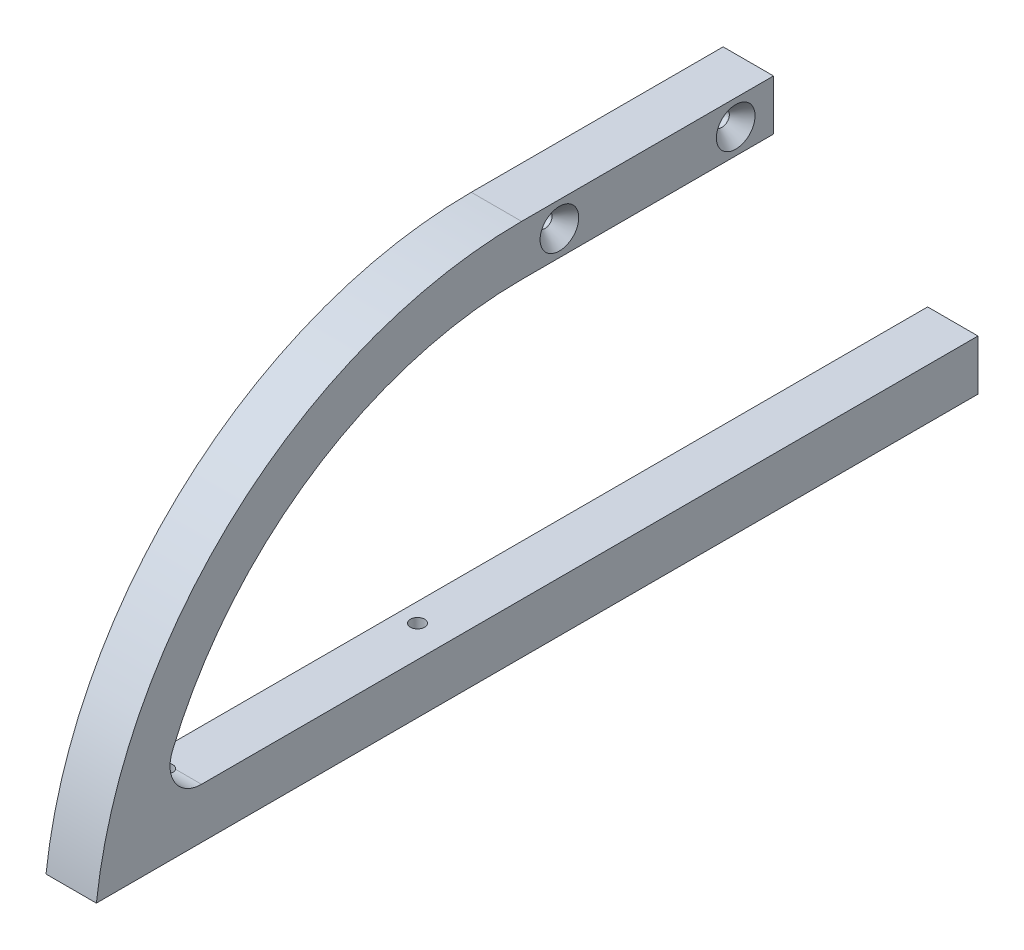
ISO-10303-21;
HEADER;
FILE_DESCRIPTION(('STEP AP214'),'2;1');
FILE_NAME('part.step','',(''),(''),'','','');
FILE_SCHEMA(('AUTOMOTIVE_DESIGN { 1 0 10303 214 1 1 1 1 }'));
ENDSEC;
DATA;
#1=APPLICATION_CONTEXT('core data for automotive mechanical design processes');
#2=APPLICATION_PROTOCOL_DEFINITION('international standard','automotive_design',2000,#1);
#3=PRODUCT_CONTEXT('',#1,'mechanical');
#4=PRODUCT('Part','Part','',(#3));
#5=PRODUCT_RELATED_PRODUCT_CATEGORY('part','',(#4));
#6=PRODUCT_DEFINITION_FORMATION('','',#4);
#7=PRODUCT_DEFINITION_CONTEXT('part definition',#1,'design');
#8=PRODUCT_DEFINITION('design','',#6,#7);
#9=PRODUCT_DEFINITION_SHAPE('','',#8);
#10=(LENGTH_UNIT() NAMED_UNIT(*) SI_UNIT(.MILLI.,.METRE.));
#11=(NAMED_UNIT(*) PLANE_ANGLE_UNIT() SI_UNIT($,.RADIAN.));
#12=(NAMED_UNIT(*) SI_UNIT($,.STERADIAN.) SOLID_ANGLE_UNIT());
#13=UNCERTAINTY_MEASURE_WITH_UNIT(LENGTH_MEASURE(1.E-05),#10,'distance_accuracy_value','');
#14=(GEOMETRIC_REPRESENTATION_CONTEXT(3) GLOBAL_UNCERTAINTY_ASSIGNED_CONTEXT((#13)) GLOBAL_UNIT_ASSIGNED_CONTEXT((#10,
#11,#12)) REPRESENTATION_CONTEXT('',''));
#15=CARTESIAN_POINT('',(0.,0.,0.));
#16=DIRECTION('',(0.,0.,1.));
#17=DIRECTION('',(1.,0.,0.));
#18=AXIS2_PLACEMENT_3D('',#15,#16,#17);
#19=CARTESIAN_POINT('',(10.16,0.,0.));
#20=DIRECTION('',(0.,0.,1.));
#21=DIRECTION('',(0.,-1.,0.));
#22=AXIS2_PLACEMENT_3D('',#19,#20,#21);
#23=PLANE('',#22);
#24=DIRECTION('',(0.,1.,0.));
#25=VECTOR('',#24,1.);
#26=CARTESIAN_POINT('',(0.,0.,0.));
#27=LINE('',#26,#25);
#28=CARTESIAN_POINT('',(0.,-10.16,0.));
#29=VERTEX_POINT('',#28);
#30=CARTESIAN_POINT('',(0.,0.,0.));
#31=VERTEX_POINT('',#30);
#32=EDGE_CURVE('E147',#29,#31,#27,.T.);
#33=ORIENTED_EDGE('',*,*,#32,.T.);
#34=DIRECTION('',(-1.,0.,0.));
#35=VECTOR('',#34,1.);
#36=CARTESIAN_POINT('',(10.16,0.,0.));
#37=LINE('',#36,#35);
#38=CARTESIAN_POINT('',(10.16,0.,0.));
#39=VERTEX_POINT('',#38);
#40=EDGE_CURVE('E11',#39,#31,#37,.T.);
#41=ORIENTED_EDGE('',*,*,#40,.F.);
#42=DIRECTION('',(0.,1.,0.));
#43=VECTOR('',#42,1.);
#44=CARTESIAN_POINT('',(10.16,0.,0.));
#45=LINE('',#44,#43);
#46=CARTESIAN_POINT('',(10.16,-10.16,0.));
#47=VERTEX_POINT('',#46);
#48=EDGE_CURVE('E166',#47,#39,#45,.T.);
#49=ORIENTED_EDGE('',*,*,#48,.F.);
#50=DIRECTION('',(-1.,0.,0.));
#51=VECTOR('',#50,1.);
#52=CARTESIAN_POINT('',(10.16,-10.16,0.));
#53=LINE('',#52,#51);
#54=EDGE_CURVE('E143',#47,#29,#53,.T.);
#55=ORIENTED_EDGE('',*,*,#54,.T.);
#56=EDGE_LOOP('',(#33,#41,#49,#55));
#57=FACE_BOUND('',#56,.T.);
#58=ADVANCED_FACE('F35',(#57),#23,.F.);
#59=CARTESIAN_POINT('',(10.16,0.,0.));
#60=DIRECTION('',(0.,-1.,0.));
#61=DIRECTION('',(0.,0.,-1.));
#62=AXIS2_PLACEMENT_3D('',#59,#60,#61);
#63=PLANE('',#62);
#64=DIRECTION('',(0.,0.,1.));
#65=VECTOR('',#64,1.);
#66=CARTESIAN_POINT('',(0.,0.,0.));
#67=LINE('',#66,#65);
#68=CARTESIAN_POINT('',(0.,0.,50.8));
#69=VERTEX_POINT('',#68);
#70=EDGE_CURVE('E150',#31,#69,#67,.T.);
#71=ORIENTED_EDGE('',*,*,#70,.T.);
#72=DIRECTION('',(-1.,0.,0.));
#73=VECTOR('',#72,1.);
#74=CARTESIAN_POINT('',(10.16,0.,50.8));
#75=LINE('',#74,#73);
#76=CARTESIAN_POINT('',(10.16,0.,50.8));
#77=VERTEX_POINT('',#76);
#78=EDGE_CURVE('E43',#77,#69,#75,.T.);
#79=ORIENTED_EDGE('',*,*,#78,.F.);
#80=DIRECTION('',(0.,0.,1.));
#81=VECTOR('',#80,1.);
#82=CARTESIAN_POINT('',(10.16,0.,0.));
#83=LINE('',#82,#81);
#84=EDGE_CURVE('E102',#39,#77,#83,.T.);
#85=ORIENTED_EDGE('',*,*,#84,.F.);
#86=ORIENTED_EDGE('',*,*,#40,.T.);
#87=EDGE_LOOP('',(#71,#79,#85,#86));
#88=FACE_BOUND('',#87,.T.);
#89=ADVANCED_FACE('F249',(#88),#63,.F.);
#90=CARTESIAN_POINT('',(10.16,-86.36,50.8));
#91=DIRECTION('',(-1.,0.,0.));
#92=DIRECTION('',(0.,0.,1.));
#93=AXIS2_PLACEMENT_3D('',#90,#91,#92);
#94=CYLINDRICAL_SURFACE('',#93,86.36);
#95=CARTESIAN_POINT('',(0.,-86.36,50.8));
#96=DIRECTION('',(1.,0.,0.));
#97=DIRECTION('',(0.,0.,-1.));
#98=AXIS2_PLACEMENT_3D('',#95,#96,#97);
#99=CIRCLE('',#98,86.36);
#100=CARTESIAN_POINT('',(0.,-76.2,136.560270521961));
#101=VERTEX_POINT('',#100);
#102=EDGE_CURVE('E153',#69,#101,#99,.T.);
#103=ORIENTED_EDGE('',*,*,#102,.T.);
#104=DIRECTION('',(-1.,0.,0.));
#105=VECTOR('',#104,1.);
#106=CARTESIAN_POINT('',(10.16,-76.2,136.560270521961));
#107=LINE('',#106,#105);
#108=CARTESIAN_POINT('',(10.16,-76.2,136.560270521961));
#109=VERTEX_POINT('',#108);
#110=EDGE_CURVE('E177',#109,#101,#107,.T.);
#111=ORIENTED_EDGE('',*,*,#110,.F.);
#112=CARTESIAN_POINT('',(10.16,-86.36,50.8));
#113=DIRECTION('',(1.,0.,0.));
#114=DIRECTION('',(0.,0.,-1.));
#115=AXIS2_PLACEMENT_3D('',#112,#113,#114);
#116=CIRCLE('',#115,86.36);
#117=EDGE_CURVE('E186',#77,#109,#116,.T.);
#118=ORIENTED_EDGE('',*,*,#117,.F.);
#119=ORIENTED_EDGE('',*,*,#78,.T.);
#120=EDGE_LOOP('',(#103,#111,#118,#119));
#121=FACE_BOUND('',#120,.T.);
#122=ADVANCED_FACE('F184',(#121),#94,.T.);
#123=CARTESIAN_POINT('',(10.16,-76.2,136.560270521961));
#124=DIRECTION('',(0.,1.,0.));
#125=DIRECTION('',(0.,0.,1.));
#126=AXIS2_PLACEMENT_3D('',#123,#124,#125);
#127=PLANE('',#126);
#128=CARTESIAN_POINT('',(3.81,-76.2,116.240270521961));
#129=DIRECTION('',(0.,-1.,0.));
#130=DIRECTION('',(0.,0.,-1.));
#131=AXIS2_PLACEMENT_3D('',#128,#129,#130);
#132=CIRCLE('',#131,1.4224);
#133=CARTESIAN_POINT('',(3.81,-76.2,114.817870521961));
#134=VERTEX_POINT('',#133);
#135=EDGE_CURVE('E214',#134,#134,#132,.T.);
#136=ORIENTED_EDGE('',*,*,#135,.F.);
#137=EDGE_LOOP('',(#136));
#138=FACE_BOUND('',#137,.T.);
#139=CARTESIAN_POINT('',(3.81,-76.2,65.4402705219614));
#140=DIRECTION('',(0.,-1.,0.));
#141=DIRECTION('',(0.,0.,-1.));
#142=AXIS2_PLACEMENT_3D('',#139,#140,#141);
#143=CIRCLE('',#142,1.4224);
#144=CARTESIAN_POINT('',(3.81,-76.2,64.0178705219614));
#145=VERTEX_POINT('',#144);
#146=EDGE_CURVE('E215',#145,#145,#143,.T.);
#147=ORIENTED_EDGE('',*,*,#146,.F.);
#148=EDGE_LOOP('',(#147));
#149=FACE_BOUND('',#148,.T.);
#150=DIRECTION('',(0.,0.,-1.));
#151=VECTOR('',#150,1.);
#152=CARTESIAN_POINT('',(0.,-76.2,136.560270521961));
#153=LINE('',#152,#151);
#154=CARTESIAN_POINT('',(0.,-76.2,-41.2397294780386));
#155=VERTEX_POINT('',#154);
#156=EDGE_CURVE('E155',#101,#155,#153,.T.);
#157=ORIENTED_EDGE('',*,*,#156,.T.);
#158=DIRECTION('',(-1.,0.,0.));
#159=VECTOR('',#158,1.);
#160=CARTESIAN_POINT('',(10.16,-76.2,-41.2397294780386));
#161=LINE('',#160,#159);
#162=CARTESIAN_POINT('',(10.16,-76.2,-41.2397294780386));
#163=VERTEX_POINT('',#162);
#164=EDGE_CURVE('E174',#163,#155,#161,.T.);
#165=ORIENTED_EDGE('',*,*,#164,.F.);
#166=DIRECTION('',(0.,0.,-1.));
#167=VECTOR('',#166,1.);
#168=CARTESIAN_POINT('',(10.16,-76.2,136.560270521961));
#169=LINE('',#168,#167);
#170=EDGE_CURVE('E202',#109,#163,#169,.T.);
#171=ORIENTED_EDGE('',*,*,#170,.F.);
#172=ORIENTED_EDGE('',*,*,#110,.T.);
#173=EDGE_LOOP('',(#157,#165,#171,#172));
#174=FACE_BOUND('',#173,.T.);
#175=ADVANCED_FACE('F195',(#138,#149,#174),#127,.F.);
#176=CARTESIAN_POINT('',(10.16,-66.04,-41.2397294780386));
#177=DIRECTION('',(0.,0.,1.));
#178=DIRECTION('',(1.,0.,0.));
#179=AXIS2_PLACEMENT_3D('',#176,#177,#178);
#180=PLANE('',#179);
#181=DIRECTION('',(0.,1.,0.));
#182=VECTOR('',#181,1.);
#183=CARTESIAN_POINT('',(0.,-66.04,-41.2397294780386));
#184=LINE('',#183,#182);
#185=CARTESIAN_POINT('',(0.,-66.04,-41.2397294780386));
#186=VERTEX_POINT('',#185);
#187=EDGE_CURVE('E157',#155,#186,#184,.T.);
#188=ORIENTED_EDGE('',*,*,#187,.T.);
#189=DIRECTION('',(-1.,0.,0.));
#190=VECTOR('',#189,1.);
#191=CARTESIAN_POINT('',(10.16,-66.04,-41.2397294780386));
#192=LINE('',#191,#190);
#193=CARTESIAN_POINT('',(10.16,-66.04,-41.2397294780386));
#194=VERTEX_POINT('',#193);
#195=EDGE_CURVE('E171',#194,#186,#192,.T.);
#196=ORIENTED_EDGE('',*,*,#195,.F.);
#197=DIRECTION('',(0.,1.,0.));
#198=VECTOR('',#197,1.);
#199=CARTESIAN_POINT('',(10.16,-66.04,-41.2397294780386));
#200=LINE('',#199,#198);
#201=EDGE_CURVE('E201',#163,#194,#200,.T.);
#202=ORIENTED_EDGE('',*,*,#201,.F.);
#203=ORIENTED_EDGE('',*,*,#164,.T.);
#204=EDGE_LOOP('',(#188,#196,#202,#203));
#205=FACE_BOUND('',#204,.T.);
#206=ADVANCED_FACE('F199',(#205),#180,.F.);
#207=CARTESIAN_POINT('',(10.16,-66.04,115.357986337865));
#208=DIRECTION('',(0.,-1.,0.));
#209=DIRECTION('',(0.,0.,-1.));
#210=AXIS2_PLACEMENT_3D('',#207,#208,#209);
#211=PLANE('',#210);
#212=CARTESIAN_POINT('',(3.81,-66.04,65.4402705219614));
#213=DIRECTION('',(0.,-1.,0.));
#214=DIRECTION('',(0.,0.,-1.));
#215=AXIS2_PLACEMENT_3D('',#212,#213,#214);
#216=CIRCLE('',#215,1.4224);
#217=CARTESIAN_POINT('',(3.81,-66.04,64.0178705219614));
#218=VERTEX_POINT('',#217);
#219=EDGE_CURVE('E211',#218,#218,#216,.F.);
#220=ORIENTED_EDGE('',*,*,#219,.F.);
#221=EDGE_LOOP('',(#220));
#222=FACE_BOUND('',#221,.T.);
#223=DIRECTION('',(-1.,0.,0.));
#224=VECTOR('',#223,1.);
#225=CARTESIAN_POINT('',(10.16,-66.04,115.357986337865));
#226=LINE('',#225,#224);
#227=CARTESIAN_POINT('',(2.69429556848874,-66.04,115.357986337865));
#228=VERTEX_POINT('',#227);
#229=CARTESIAN_POINT('',(0.,-66.04,115.357986337865));
#230=VERTEX_POINT('',#229);
#231=EDGE_CURVE('E138',#228,#230,#226,.T.);
#232=ORIENTED_EDGE('',*,*,#231,.F.);
#233=CARTESIAN_POINT('',(3.81,-66.04,116.240270521961));
#234=DIRECTION('',(0.,-1.,0.));
#235=DIRECTION('',(0.,0.,-1.));
#236=AXIS2_PLACEMENT_3D('',#233,#234,#235);
#237=CIRCLE('',#236,1.4224);
#238=CARTESIAN_POINT('',(4.92570443151126,-66.04,115.357986337865));
#239=VERTEX_POINT('',#238);
#240=EDGE_CURVE('E49',#239,#228,#237,.F.);
#241=ORIENTED_EDGE('',*,*,#240,.F.);
#242=CARTESIAN_POINT('',(10.16,-66.04,115.357986337865));
#243=VERTEX_POINT('',#242);
#244=EDGE_CURVE('E169',#243,#239,#226,.T.);
#245=ORIENTED_EDGE('',*,*,#244,.F.);
#246=DIRECTION('',(0.,0.,1.));
#247=VECTOR('',#246,1.);
#248=CARTESIAN_POINT('',(10.16,-66.04,115.357986337865));
#249=LINE('',#248,#247);
#250=EDGE_CURVE('E126',#194,#243,#249,.T.);
#251=ORIENTED_EDGE('',*,*,#250,.F.);
#252=ORIENTED_EDGE('',*,*,#195,.T.);
#253=DIRECTION('',(0.,0.,1.));
#254=VECTOR('',#253,1.);
#255=CARTESIAN_POINT('',(0.,-66.04,115.357986337865));
#256=LINE('',#255,#254);
#257=EDGE_CURVE('E159',#186,#230,#256,.T.);
#258=ORIENTED_EDGE('',*,*,#257,.T.);
#259=EDGE_LOOP('',(#232,#241,#245,#251,#252,#258));
#260=FACE_BOUND('',#259,.T.);
#261=ADVANCED_FACE('F270',(#222,#260),#211,.F.);
#262=CARTESIAN_POINT('',(10.16,-59.69,115.357986337865));
#263=DIRECTION('',(-1.,0.,0.));
#264=DIRECTION('',(0.,0.,1.));
#265=AXIS2_PLACEMENT_3D('',#262,#263,#264);
#266=CYLINDRICAL_SURFACE('',#265,6.34999999999998);
#267=ORIENTED_EDGE('',*,*,#244,.T.);
#268=CARTESIAN_POINT('',(2.69429556848874,-66.04,115.357986337865));
#269=CARTESIAN_POINT('',(2.66988244436186,-66.0400004283094,115.388858396043));
#270=CARTESIAN_POINT('',(2.64676257572886,-66.0397745151044,115.420730263164));
#271=CARTESIAN_POINT('',(2.60324464580971,-66.038788684363,115.486272961052));
#272=CARTESIAN_POINT('',(2.58284658879113,-66.0380287659892,115.519943794639));
#273=CARTESIAN_POINT('',(2.52600683471812,-66.034829884935,115.623228875102));
#274=CARTESIAN_POINT('',(2.49383024931892,-66.0314723824016,115.695228882461));
#275=CARTESIAN_POINT('',(2.4418295477678,-66.0218556018953,115.843396702975));
#276=CARTESIAN_POINT('',(2.42201462164844,-66.0155941710686,115.919567571224));
#277=CARTESIAN_POINT('',(2.39520839911046,-65.9999998687168,116.073810001566));
#278=CARTESIAN_POINT('',(2.3882135554076,-65.9906678476595,116.151881031831));
#279=CARTESIAN_POINT('',(2.38706391682271,-65.969075829971,116.307665274214));
#280=CARTESIAN_POINT('',(2.39290369378621,-65.9568170731008,116.385378623677));
#281=CARTESIAN_POINT('',(2.41703988077849,-65.9298028226888,116.538411704328));
#282=CARTESIAN_POINT('',(2.43534054245545,-65.9150464782629,116.61373060935));
#283=CARTESIAN_POINT('',(2.48438646411037,-65.8833082936096,116.762029438603));
#284=CARTESIAN_POINT('',(2.51545113280283,-65.8662775291947,116.834893115699));
#285=CARTESIAN_POINT('',(2.5890857684445,-65.8312688905405,116.974306063313));
#286=CARTESIAN_POINT('',(2.63165764930956,-65.8132908591495,117.040854280934));
#287=CARTESIAN_POINT('',(2.72889382944747,-65.7768822793389,117.168208315592));
#288=CARTESIAN_POINT('',(2.78392538114319,-65.7584575808492,117.228735980186));
#289=CARTESIAN_POINT('',(2.90381625230118,-65.7231374148186,117.339690272461));
#290=CARTESIAN_POINT('',(2.96867647493665,-65.7062420880423,117.390115970867));
#291=CARTESIAN_POINT('',(3.10632578142684,-65.6754408802452,117.479121192699));
#292=CARTESIAN_POINT('',(3.17907996714481,-65.6615225895407,117.517750190517));
#293=CARTESIAN_POINT('',(3.3307434177293,-65.6378844052917,117.582026415699));
#294=CARTESIAN_POINT('',(3.40964970746943,-65.6281624970839,117.607679873578));
#295=CARTESIAN_POINT('',(3.56665057455048,-65.6143173192299,117.643882461096));
#296=CARTESIAN_POINT('',(3.64454401111525,-65.6099114939067,117.655195681573));
#297=CARTESIAN_POINT('',(3.80124123795467,-65.6061739079382,117.664805920865));
#298=CARTESIAN_POINT('',(3.88004474291344,-65.6068405979321,117.663106914163));
#299=CARTESIAN_POINT('',(4.03242547560866,-65.6130259824339,117.647162243959));
#300=CARTESIAN_POINT('',(4.10607490934497,-65.618316635803,117.633506210929));
#301=CARTESIAN_POINT('',(4.24994507279419,-65.6329633692791,117.5949725372));
#302=CARTESIAN_POINT('',(4.32016549053118,-65.6423198185332,117.570093877553));
#303=CARTESIAN_POINT('',(4.45671544147561,-65.6645301628902,117.509392252048));
#304=CARTESIAN_POINT('',(4.52294663813684,-65.6774466807197,117.473371760958));
#305=CARTESIAN_POINT('',(4.64855929618305,-65.70569654157,117.391643308409));
#306=CARTESIAN_POINT('',(4.70793878651646,-65.7210305770586,117.345932570002));
#307=CARTESIAN_POINT('',(4.82196263967613,-65.7540275763839,117.242968913348));
#308=CARTESIAN_POINT('',(4.87610362845113,-65.7717752962828,117.185185230437));
#309=CARTESIAN_POINT('',(4.97405166626233,-65.8075693848983,117.061508242584));
#310=CARTESIAN_POINT('',(5.01785617786234,-65.8256158257849,116.995612952402));
#311=CARTESIAN_POINT('',(5.09545656013483,-65.8615320959307,116.85470439547));
#312=CARTESIAN_POINT('',(5.12881710032417,-65.879370107683,116.779442371581));
#313=CARTESIAN_POINT('',(5.18215697186797,-65.9130467711359,116.623890947756));
#314=CARTESIAN_POINT('',(5.20213779535417,-65.9288856456242,116.543602109512));
#315=CARTESIAN_POINT('',(5.22769829648844,-65.9574876974297,116.381584824771));
#316=CARTESIAN_POINT('',(5.23350439435771,-65.9702962395719,116.299900291897));
#317=CARTESIAN_POINT('',(5.23094989944314,-65.9926622539956,116.13629200639));
#318=CARTESIAN_POINT('',(5.22259016080894,-66.0022199222515,116.054368268478));
#319=CARTESIAN_POINT('',(5.19233616303253,-66.0176668864073,115.895812323632));
#320=CARTESIAN_POINT('',(5.17094085094529,-66.0236760403634,115.819095832417));
#321=CARTESIAN_POINT('',(5.11557757701422,-66.0327576425655,115.670200264772));
#322=CARTESIAN_POINT('',(5.08162340873388,-66.035833299498,115.59801631156));
#323=CARTESIAN_POINT('',(5.02464759164531,-66.038498995904,115.499289086226));
#324=CARTESIAN_POINT('',(5.00628482611624,-66.0390765814098,115.469997479767));
#325=CARTESIAN_POINT('',(4.96751135045616,-66.0398266386398,115.412879452734));
#326=CARTESIAN_POINT('',(4.94710465518134,-66.0399998889268,115.385050317337));
#327=CARTESIAN_POINT('',(4.9257044315113,-66.04,115.357986337865));
#328=B_SPLINE_CURVE_WITH_KNOTS('',3,(#268,#269,#270,#271,#272,#273,#274,#275,#276,#277,#278,
#279,#280,#281,#282,#283,#284,#285,#286,#287,#288,#289,#290,#291,#292,#293,#294,#295,#296,#297,
#298,#299,#300,#301,#302,#303,#304,#305,#306,#307,#308,#309,#310,#311,#312,#313,#314,#315,#316,
#317,#318,#319,#320,#321,#322,#323,#324,#325,#326,#327),.UNSPECIFIED.,.F.,.F.,(4,2,2,2,2,2,2,2,
2,2,2,2,2,2,2,2,2,2,2,2,2,2,2,2,2,2,2,2,2,4),(0.,0.118004456886037,0.236009098791034,
0.471591356027589,0.707348544204094,0.943040489111693,1.17863277185446,1.41430547888362,
1.65627443492531,1.89828366079754,2.14866164624769,2.39906265332191,2.64839860163888,
2.89761471145371,3.13290124825732,3.3681159214808,3.59234613885113,3.81659671908707,
4.0450758796081,4.2736206044316,4.51598375257635,4.75840633516089,5.00989069214432,
5.26134699843563,5.50875959187095,5.75615726773632,5.99463340052123,6.2328483857175,
6.33650023641894,6.43995233630788),.UNSPECIFIED.);
#329=EDGE_CURVE('E219',#228,#239,#328,.T.);
#330=ORIENTED_EDGE('',*,*,#329,.F.);
#331=ORIENTED_EDGE('',*,*,#231,.T.);
#332=CARTESIAN_POINT('',(0.,-59.69,115.357986337865));
#333=DIRECTION('',(-1.,0.,0.));
#334=DIRECTION('',(0.,0.,1.));
#335=AXIS2_PLACEMENT_3D('',#332,#333,#334);
#336=CIRCLE('',#335,6.34999999999998);
#337=CARTESIAN_POINT('',(0.,-57.2654545454546,121.226894186762));
#338=VERTEX_POINT('',#337);
#339=EDGE_CURVE('E135',#230,#338,#336,.T.);
#340=ORIENTED_EDGE('',*,*,#339,.T.);
#341=DIRECTION('',(-1.,0.,0.));
#342=VECTOR('',#341,1.);
#343=CARTESIAN_POINT('',(10.16,-57.2654545454546,121.226894186762));
#344=LINE('',#343,#342);
#345=CARTESIAN_POINT('',(10.16,-57.2654545454546,121.226894186762));
#346=VERTEX_POINT('',#345);
#347=EDGE_CURVE('E132',#346,#338,#344,.T.);
#348=ORIENTED_EDGE('',*,*,#347,.F.);
#349=CARTESIAN_POINT('',(10.16,-59.69,115.357986337865));
#350=DIRECTION('',(-1.,0.,0.));
#351=DIRECTION('',(0.,0.,1.));
#352=AXIS2_PLACEMENT_3D('',#349,#350,#351);
#353=CIRCLE('',#352,6.34999999999998);
#354=EDGE_CURVE('E119',#243,#346,#353,.T.);
#355=ORIENTED_EDGE('',*,*,#354,.F.);
#356=EDGE_LOOP('',(#267,#330,#331,#340,#348,#355));
#357=FACE_BOUND('',#356,.T.);
#358=ADVANCED_FACE('F133',(#357),#266,.F.);
#359=CARTESIAN_POINT('',(10.16,-86.36,50.8));
#360=DIRECTION('',(-1.,0.,0.));
#361=DIRECTION('',(0.,0.,1.));
#362=AXIS2_PLACEMENT_3D('',#359,#360,#361);
#363=CYLINDRICAL_SURFACE('',#362,76.2);
#364=CARTESIAN_POINT('',(0.,-86.36,50.8));
#365=DIRECTION('',(-1.,0.,0.));
#366=DIRECTION('',(0.,0.,-1.));
#367=AXIS2_PLACEMENT_3D('',#364,#365,#366);
#368=CIRCLE('',#367,76.2);
#369=CARTESIAN_POINT('',(0.,-10.16,50.8));
#370=VERTEX_POINT('',#369);
#371=EDGE_CURVE('E163',#338,#370,#368,.T.);
#372=ORIENTED_EDGE('',*,*,#371,.T.);
#373=DIRECTION('',(-1.,0.,0.));
#374=VECTOR('',#373,1.);
#375=CARTESIAN_POINT('',(10.16,-10.16,50.8));
#376=LINE('',#375,#374);
#377=CARTESIAN_POINT('',(10.16,-10.16,50.8));
#378=VERTEX_POINT('',#377);
#379=EDGE_CURVE('E139',#378,#370,#376,.T.);
#380=ORIENTED_EDGE('',*,*,#379,.F.);
#381=CARTESIAN_POINT('',(10.16,-86.36,50.8));
#382=DIRECTION('',(-1.,0.,0.));
#383=DIRECTION('',(0.,0.,-1.));
#384=AXIS2_PLACEMENT_3D('',#381,#382,#383);
#385=CIRCLE('',#384,76.2);
#386=EDGE_CURVE('E123',#346,#378,#385,.T.);
#387=ORIENTED_EDGE('',*,*,#386,.F.);
#388=ORIENTED_EDGE('',*,*,#347,.T.);
#389=EDGE_LOOP('',(#372,#380,#387,#388));
#390=FACE_BOUND('',#389,.T.);
#391=ADVANCED_FACE('F141',(#390),#363,.F.);
#392=CARTESIAN_POINT('',(10.16,-10.16,0.));
#393=DIRECTION('',(0.,1.,0.));
#394=DIRECTION('',(0.,0.,1.));
#395=AXIS2_PLACEMENT_3D('',#392,#393,#394);
#396=PLANE('',#395);
#397=DIRECTION('',(0.,0.,-1.));
#398=VECTOR('',#397,1.);
#399=CARTESIAN_POINT('',(0.,-10.16,0.));
#400=LINE('',#399,#398);
#401=EDGE_CURVE('E94',#370,#29,#400,.T.);
#402=ORIENTED_EDGE('',*,*,#401,.T.);
#403=ORIENTED_EDGE('',*,*,#54,.F.);
#404=DIRECTION('',(0.,0.,-1.));
#405=VECTOR('',#404,1.);
#406=CARTESIAN_POINT('',(10.16,-10.16,0.));
#407=LINE('',#406,#405);
#408=EDGE_CURVE('E58',#378,#47,#407,.T.);
#409=ORIENTED_EDGE('',*,*,#408,.F.);
#410=ORIENTED_EDGE('',*,*,#379,.T.);
#411=EDGE_LOOP('',(#402,#403,#409,#410));
#412=FACE_BOUND('',#411,.T.);
#413=ADVANCED_FACE('F256',(#412),#396,.F.);
#414=CARTESIAN_POINT('',(10.16,-86.36,50.8));
#415=DIRECTION('',(1.,0.,0.));
#416=DIRECTION('',(0.,0.,-1.));
#417=AXIS2_PLACEMENT_3D('',#414,#415,#416);
#418=PLANE('',#417);
#419=CARTESIAN_POINT('',(10.16,-5.08,43.18));
#420=DIRECTION('',(1.,0.,0.));
#421=DIRECTION('',(0.,0.,-1.));
#422=AXIS2_PLACEMENT_3D('',#419,#420,#421);
#423=CIRCLE('',#422,3.8989);
#424=CARTESIAN_POINT('',(10.16,-5.08,39.2811));
#425=VERTEX_POINT('',#424);
#426=EDGE_CURVE('E392',#425,#425,#423,.T.);
#427=ORIENTED_EDGE('',*,*,#426,.F.);
#428=EDGE_LOOP('',(#427));
#429=FACE_BOUND('',#428,.T.);
#430=CARTESIAN_POINT('',(10.16,-5.08,7.62));
#431=DIRECTION('',(1.,0.,0.));
#432=DIRECTION('',(0.,0.,-1.));
#433=AXIS2_PLACEMENT_3D('',#430,#431,#432);
#434=CIRCLE('',#433,3.8989);
#435=CARTESIAN_POINT('',(10.16,-5.08,3.7211));
#436=VERTEX_POINT('',#435);
#437=EDGE_CURVE('E382',#436,#436,#434,.T.);
#438=ORIENTED_EDGE('',*,*,#437,.F.);
#439=EDGE_LOOP('',(#438));
#440=FACE_BOUND('',#439,.T.);
#441=ORIENTED_EDGE('',*,*,#48,.T.);
#442=ORIENTED_EDGE('',*,*,#84,.T.);
#443=ORIENTED_EDGE('',*,*,#117,.T.);
#444=ORIENTED_EDGE('',*,*,#170,.T.);
#445=ORIENTED_EDGE('',*,*,#201,.T.);
#446=ORIENTED_EDGE('',*,*,#250,.T.);
#447=ORIENTED_EDGE('',*,*,#354,.T.);
#448=ORIENTED_EDGE('',*,*,#386,.T.);
#449=ORIENTED_EDGE('',*,*,#408,.T.);
#450=EDGE_LOOP('',(#441,#442,#443,#444,#445,#446,#447,#448,#449));
#451=FACE_BOUND('',#450,.T.);
#452=ADVANCED_FACE('F121',(#429,#440,#451),#418,.T.);
#453=CARTESIAN_POINT('',(0.,-86.36,50.8));
#454=DIRECTION('',(1.,0.,0.));
#455=DIRECTION('',(0.,0.,-1.));
#456=AXIS2_PLACEMENT_3D('',#453,#454,#455);
#457=PLANE('',#456);
#458=CARTESIAN_POINT('',(0.,-5.08,43.18));
#459=DIRECTION('',(1.,0.,0.));
#460=DIRECTION('',(0.,0.,-1.));
#461=AXIS2_PLACEMENT_3D('',#458,#459,#460);
#462=CIRCLE('',#461,1.397);
#463=CARTESIAN_POINT('',(0.,-5.08,41.783));
#464=VERTEX_POINT('',#463);
#465=EDGE_CURVE('E384',#464,#464,#462,.T.);
#466=ORIENTED_EDGE('',*,*,#465,.T.);
#467=EDGE_LOOP('',(#466));
#468=FACE_BOUND('',#467,.T.);
#469=CARTESIAN_POINT('',(0.,-5.08,7.62));
#470=DIRECTION('',(1.,0.,0.));
#471=DIRECTION('',(0.,0.,-1.));
#472=AXIS2_PLACEMENT_3D('',#469,#470,#471);
#473=CIRCLE('',#472,1.4859);
#474=CARTESIAN_POINT('',(0.,-5.08,6.1341));
#475=VERTEX_POINT('',#474);
#476=EDGE_CURVE('E151',#475,#475,#473,.T.);
#477=ORIENTED_EDGE('',*,*,#476,.T.);
#478=EDGE_LOOP('',(#477));
#479=FACE_BOUND('',#478,.T.);
#480=ORIENTED_EDGE('',*,*,#32,.F.);
#481=ORIENTED_EDGE('',*,*,#401,.F.);
#482=ORIENTED_EDGE('',*,*,#371,.F.);
#483=ORIENTED_EDGE('',*,*,#339,.F.);
#484=ORIENTED_EDGE('',*,*,#257,.F.);
#485=ORIENTED_EDGE('',*,*,#187,.F.);
#486=ORIENTED_EDGE('',*,*,#156,.F.);
#487=ORIENTED_EDGE('',*,*,#102,.F.);
#488=ORIENTED_EDGE('',*,*,#70,.F.);
#489=EDGE_LOOP('',(#480,#481,#482,#483,#484,#485,#486,#487,#488));
#490=FACE_BOUND('',#489,.T.);
#491=ADVANCED_FACE('F190',(#468,#479,#490),#457,.F.);
#492=CARTESIAN_POINT('',(0.,-5.08,7.62));
#493=DIRECTION('',(1.,0.,0.));
#494=DIRECTION('',(0.,0.,-1.));
#495=AXIS2_PLACEMENT_3D('',#492,#493,#494);
#496=CYLINDRICAL_SURFACE('',#495,1.4859);
#497=CARTESIAN_POINT('',(7.3841610333757,-5.08,7.62));
#498=DIRECTION('',(1.,0.,0.));
#499=DIRECTION('',(0.,0.,-1.));
#500=AXIS2_PLACEMENT_3D('',#497,#498,#499);
#501=CIRCLE('',#500,1.4859);
#502=CARTESIAN_POINT('',(7.3841610333757,-5.08,6.1341));
#503=VERTEX_POINT('',#502);
#504=EDGE_CURVE('E38',#503,#503,#501,.T.);
#505=ORIENTED_EDGE('',*,*,#504,.T.);
#506=EDGE_LOOP('',(#505));
#507=FACE_BOUND('',#506,.T.);
#508=ORIENTED_EDGE('',*,*,#476,.F.);
#509=EDGE_LOOP('',(#508));
#510=FACE_BOUND('',#509,.T.);
#511=ADVANCED_FACE('F325',(#507,#510),#496,.F.);
#512=CARTESIAN_POINT('',(3.81,0.00100000000001488,116.240270521961));
#513=DIRECTION('',(0.,-1.,0.));
#514=DIRECTION('',(0.,0.,-1.));
#515=AXIS2_PLACEMENT_3D('',#512,#513,#514);
#516=CYLINDRICAL_SURFACE('',#515,1.4224);
#517=ORIENTED_EDGE('',*,*,#135,.T.);
#518=EDGE_LOOP('',(#517));
#519=FACE_BOUND('',#518,.T.);
#520=ORIENTED_EDGE('',*,*,#240,.T.);
#521=ORIENTED_EDGE('',*,*,#329,.T.);
#522=EDGE_LOOP('',(#520,#521));
#523=FACE_BOUND('',#522,.T.);
#524=ADVANCED_FACE('F227',(#519,#523),#516,.F.);
#525=CARTESIAN_POINT('',(3.81,0.00100000000001488,65.4402705219614));
#526=DIRECTION('',(0.,-1.,0.));
#527=DIRECTION('',(0.,0.,-1.));
#528=AXIS2_PLACEMENT_3D('',#525,#526,#527);
#529=CYLINDRICAL_SURFACE('',#528,1.4224);
#530=ORIENTED_EDGE('',*,*,#146,.T.);
#531=EDGE_LOOP('',(#530));
#532=FACE_BOUND('',#531,.T.);
#533=ORIENTED_EDGE('',*,*,#219,.T.);
#534=EDGE_LOOP('',(#533));
#535=FACE_BOUND('',#534,.T.);
#536=ADVANCED_FACE('F236',(#532,#535),#529,.F.);
#537=CARTESIAN_POINT('',(10.16,-5.08,7.62));
#538=DIRECTION('',(1.,0.,0.));
#539=DIRECTION('',(0.,0.,-1.));
#540=AXIS2_PLACEMENT_3D('',#537,#538,#539);
#541=CONICAL_SURFACE('',#540,3.8989,0.715584993317675);
#542=ORIENTED_EDGE('',*,*,#437,.T.);
#543=EDGE_LOOP('',(#542));
#544=FACE_BOUND('',#543,.T.);
#545=ORIENTED_EDGE('',*,*,#504,.F.);
#546=EDGE_LOOP('',(#545));
#547=FACE_BOUND('',#546,.T.);
#548=ADVANCED_FACE('F232',(#544,#547),#541,.F.);
#549=CARTESIAN_POINT('',(10.16,-5.08,43.18));
#550=DIRECTION('',(1.,0.,0.));
#551=DIRECTION('',(0.,0.,-1.));
#552=AXIS2_PLACEMENT_3D('',#549,#550,#551);
#553=CYLINDRICAL_SURFACE('',#552,1.397);
#554=ORIENTED_EDGE('',*,*,#465,.F.);
#555=EDGE_LOOP('',(#554));
#556=FACE_BOUND('',#555,.T.);
#557=CARTESIAN_POINT('',(7.28189328197375,-5.08,43.18));
#558=DIRECTION('',(1.,0.,0.));
#559=DIRECTION('',(0.,0.,-1.));
#560=AXIS2_PLACEMENT_3D('',#557,#558,#559);
#561=CIRCLE('',#560,1.397);
#562=CARTESIAN_POINT('',(7.28189328197375,-5.08,41.783));
#563=VERTEX_POINT('',#562);
#564=EDGE_CURVE('E387',#563,#563,#561,.T.);
#565=ORIENTED_EDGE('',*,*,#564,.T.);
#566=EDGE_LOOP('',(#565));
#567=FACE_BOUND('',#566,.T.);
#568=ADVANCED_FACE('F235',(#556,#567),#553,.F.);
#569=CARTESIAN_POINT('',(10.16,-5.08,43.18));
#570=DIRECTION('',(1.,0.,0.));
#571=DIRECTION('',(0.,0.,-1.));
#572=AXIS2_PLACEMENT_3D('',#569,#570,#571);
#573=CONICAL_SURFACE('',#572,3.8989,0.715584993317675);
#574=ORIENTED_EDGE('',*,*,#564,.F.);
#575=EDGE_LOOP('',(#574));
#576=FACE_BOUND('',#575,.T.);
#577=ORIENTED_EDGE('',*,*,#426,.T.);
#578=EDGE_LOOP('',(#577));
#579=FACE_BOUND('',#578,.T.);
#580=ADVANCED_FACE('F240',(#576,#579),#573,.F.);
#581=CLOSED_SHELL('',(#58,#89,#122,#175,#206,#261,#358,#391,#413,#452,#491,#511,#524,#536,#548,
#568,#580));
#582=MANIFOLD_SOLID_BREP('B2',#581);
#583=ADVANCED_BREP_SHAPE_REPRESENTATION('',(#18,#582),#14);
#584=SHAPE_DEFINITION_REPRESENTATION(#9,#583);
ENDSEC;
END-ISO-10303-21;
